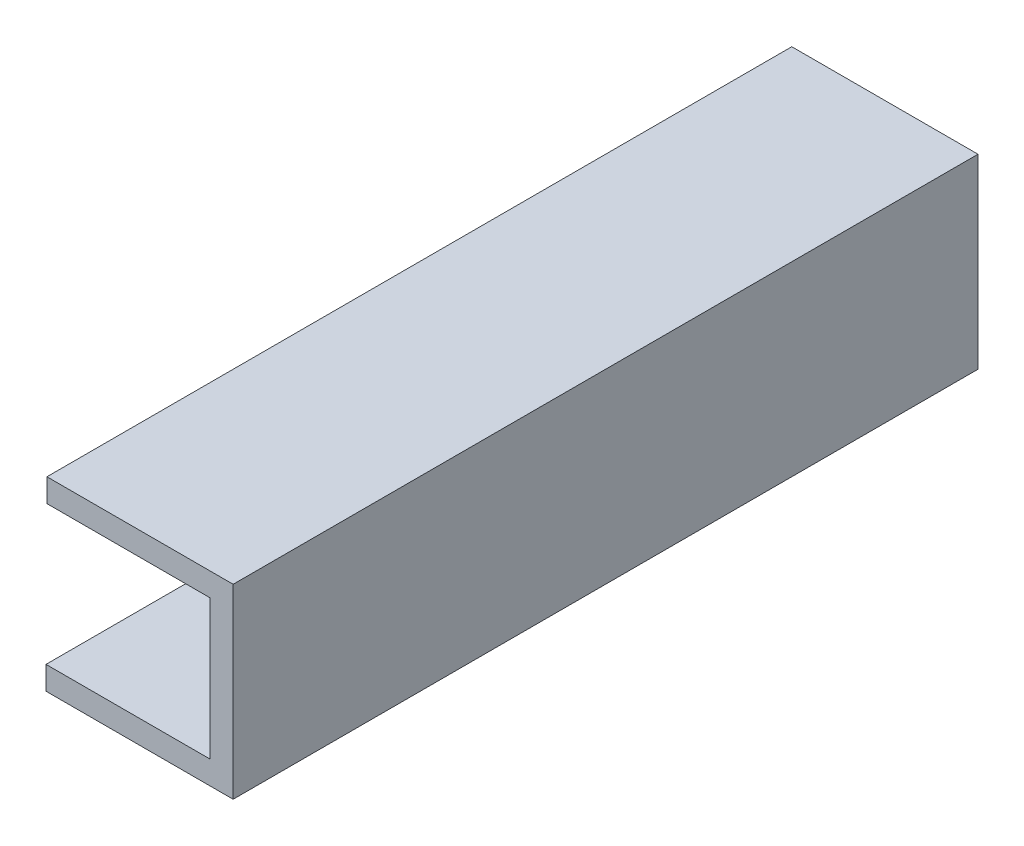
ISO-10303-21;
HEADER;
FILE_DESCRIPTION(('STEP AP214'),'2;1');
FILE_NAME('part.step','',(''),(''),'','','');
FILE_SCHEMA(('AUTOMOTIVE_DESIGN { 1 0 10303 214 1 1 1 1 }'));
ENDSEC;
DATA;
#1=APPLICATION_CONTEXT('core data for automotive mechanical design processes');
#2=APPLICATION_PROTOCOL_DEFINITION('international standard','automotive_design',2000,#1);
#3=PRODUCT_CONTEXT('',#1,'mechanical');
#4=PRODUCT('Part','Part','',(#3));
#5=PRODUCT_RELATED_PRODUCT_CATEGORY('part','',(#4));
#6=PRODUCT_DEFINITION_FORMATION('','',#4);
#7=PRODUCT_DEFINITION_CONTEXT('part definition',#1,'design');
#8=PRODUCT_DEFINITION('design','',#6,#7);
#9=PRODUCT_DEFINITION_SHAPE('','',#8);
#10=(LENGTH_UNIT() NAMED_UNIT(*) SI_UNIT(.MILLI.,.METRE.));
#11=(NAMED_UNIT(*) PLANE_ANGLE_UNIT() SI_UNIT($,.RADIAN.));
#12=(NAMED_UNIT(*) SI_UNIT($,.STERADIAN.) SOLID_ANGLE_UNIT());
#13=UNCERTAINTY_MEASURE_WITH_UNIT(LENGTH_MEASURE(1.E-05),#10,'distance_accuracy_value','');
#14=(GEOMETRIC_REPRESENTATION_CONTEXT(3) GLOBAL_UNCERTAINTY_ASSIGNED_CONTEXT((#13)) GLOBAL_UNIT_ASSIGNED_CONTEXT((#10,
#11,#12)) REPRESENTATION_CONTEXT('',''));
#15=CARTESIAN_POINT('',(0.,0.,0.));
#16=DIRECTION('',(0.,0.,1.));
#17=DIRECTION('',(1.,0.,0.));
#18=AXIS2_PLACEMENT_3D('',#15,#16,#17);
#19=CARTESIAN_POINT('',(-10.531581633942,6.84043592370634,101.6));
#20=DIRECTION('',(0.,-1.,0.));
#21=DIRECTION('',(1.,0.,0.));
#22=AXIS2_PLACEMENT_3D('',#19,#20,#21);
#23=PLANE('',#22);
#24=DIRECTION('',(-1.,0.,0.));
#25=VECTOR('',#24,1.);
#26=CARTESIAN_POINT('',(-10.531581633942,6.84043592370634,0.));
#27=LINE('',#26,#25);
#28=CARTESIAN_POINT('',(-10.531581633942,6.84043592370634,0.));
#29=VERTEX_POINT('',#28);
#30=CARTESIAN_POINT('',(-35.931581633942,6.84043592370634,0.));
#31=VERTEX_POINT('',#30);
#32=EDGE_CURVE('E129',#29,#31,#27,.T.);
#33=ORIENTED_EDGE('',*,*,#32,.T.);
#34=DIRECTION('',(0.,0.,-1.));
#35=VECTOR('',#34,1.);
#36=CARTESIAN_POINT('',(-35.931581633942,6.84043592370634,101.6));
#37=LINE('',#36,#35);
#38=CARTESIAN_POINT('',(-35.931581633942,6.84043592370634,101.6));
#39=VERTEX_POINT('',#38);
#40=EDGE_CURVE('E11',#39,#31,#37,.T.);
#41=ORIENTED_EDGE('',*,*,#40,.F.);
#42=DIRECTION('',(-1.,0.,0.));
#43=VECTOR('',#42,1.);
#44=CARTESIAN_POINT('',(-10.531581633942,6.84043592370634,101.6));
#45=LINE('',#44,#43);
#46=CARTESIAN_POINT('',(-10.531581633942,6.84043592370634,101.6));
#47=VERTEX_POINT('',#46);
#48=EDGE_CURVE('E143',#47,#39,#45,.T.);
#49=ORIENTED_EDGE('',*,*,#48,.F.);
#50=DIRECTION('',(0.,0.,-1.));
#51=VECTOR('',#50,1.);
#52=CARTESIAN_POINT('',(-10.531581633942,6.84043592370634,101.6));
#53=LINE('',#52,#51);
#54=EDGE_CURVE('E125',#47,#29,#53,.T.);
#55=ORIENTED_EDGE('',*,*,#54,.T.);
#56=EDGE_LOOP('',(#33,#41,#49,#55));
#57=FACE_BOUND('',#56,.T.);
#58=ADVANCED_FACE('F33',(#57),#23,.F.);
#59=CARTESIAN_POINT('',(-35.931581633942,6.84043592370634,101.6));
#60=DIRECTION('',(1.,0.,0.));
#61=DIRECTION('',(0.,0.,-1.));
#62=AXIS2_PLACEMENT_3D('',#59,#60,#61);
#63=PLANE('',#62);
#64=DIRECTION('',(0.,-1.,0.));
#65=VECTOR('',#64,1.);
#66=CARTESIAN_POINT('',(-35.931581633942,6.84043592370634,0.));
#67=LINE('',#66,#65);
#68=CARTESIAN_POINT('',(-35.931581633942,3.66543592370634,0.));
#69=VERTEX_POINT('',#68);
#70=EDGE_CURVE('E132',#31,#69,#67,.T.);
#71=ORIENTED_EDGE('',*,*,#70,.T.);
#72=DIRECTION('',(0.,0.,-1.));
#73=VECTOR('',#72,1.);
#74=CARTESIAN_POINT('',(-35.931581633942,3.66543592370634,101.6));
#75=LINE('',#74,#73);
#76=CARTESIAN_POINT('',(-35.931581633942,3.66543592370634,101.6));
#77=VERTEX_POINT('',#76);
#78=EDGE_CURVE('E41',#77,#69,#75,.T.);
#79=ORIENTED_EDGE('',*,*,#78,.F.);
#80=DIRECTION('',(0.,-1.,0.));
#81=VECTOR('',#80,1.);
#82=CARTESIAN_POINT('',(-35.931581633942,6.84043592370634,101.6));
#83=LINE('',#82,#81);
#84=EDGE_CURVE('E92',#39,#77,#83,.T.);
#85=ORIENTED_EDGE('',*,*,#84,.F.);
#86=ORIENTED_EDGE('',*,*,#40,.T.);
#87=EDGE_LOOP('',(#71,#79,#85,#86));
#88=FACE_BOUND('',#87,.T.);
#89=ADVANCED_FACE('F178',(#88),#63,.F.);
#90=CARTESIAN_POINT('',(-35.931581633942,3.66543592370634,101.6));
#91=DIRECTION('',(0.,1.,0.));
#92=DIRECTION('',(0.,0.,1.));
#93=AXIS2_PLACEMENT_3D('',#90,#91,#92);
#94=PLANE('',#93);
#95=DIRECTION('',(1.,0.,0.));
#96=VECTOR('',#95,1.);
#97=CARTESIAN_POINT('',(-35.931581633942,3.66543592370634,0.));
#98=LINE('',#97,#96);
#99=CARTESIAN_POINT('',(-13.706581633942,3.66543592370634,0.));
#100=VERTEX_POINT('',#99);
#101=EDGE_CURVE('E134',#69,#100,#98,.T.);
#102=ORIENTED_EDGE('',*,*,#101,.T.);
#103=DIRECTION('',(0.,0.,-1.));
#104=VECTOR('',#103,1.);
#105=CARTESIAN_POINT('',(-13.706581633942,3.66543592370634,101.6));
#106=LINE('',#105,#104);
#107=CARTESIAN_POINT('',(-13.706581633942,3.66543592370634,101.6));
#108=VERTEX_POINT('',#107);
#109=EDGE_CURVE('E150',#108,#100,#106,.T.);
#110=ORIENTED_EDGE('',*,*,#109,.F.);
#111=DIRECTION('',(1.,0.,0.));
#112=VECTOR('',#111,1.);
#113=CARTESIAN_POINT('',(-35.931581633942,3.66543592370634,101.6));
#114=LINE('',#113,#112);
#115=EDGE_CURVE('E158',#77,#108,#114,.T.);
#116=ORIENTED_EDGE('',*,*,#115,.F.);
#117=ORIENTED_EDGE('',*,*,#78,.T.);
#118=EDGE_LOOP('',(#102,#110,#116,#117));
#119=FACE_BOUND('',#118,.T.);
#120=ADVANCED_FACE('F156',(#119),#94,.F.);
#121=CARTESIAN_POINT('',(-13.706581633942,3.66543592370634,101.6));
#122=DIRECTION('',(1.,0.,0.));
#123=DIRECTION('',(0.,1.,0.));
#124=AXIS2_PLACEMENT_3D('',#121,#122,#123);
#125=PLANE('',#124);
#126=DIRECTION('',(0.,-1.,0.));
#127=VECTOR('',#126,1.);
#128=CARTESIAN_POINT('',(-13.706581633942,3.66543592370634,0.));
#129=LINE('',#128,#127);
#130=CARTESIAN_POINT('',(-13.706581633942,-15.3845640762937,0.));
#131=VERTEX_POINT('',#130);
#132=EDGE_CURVE('E136',#100,#131,#129,.T.);
#133=ORIENTED_EDGE('',*,*,#132,.T.);
#134=DIRECTION('',(0.,0.,-1.));
#135=VECTOR('',#134,1.);
#136=CARTESIAN_POINT('',(-13.706581633942,-15.3845640762937,101.6));
#137=LINE('',#136,#135);
#138=CARTESIAN_POINT('',(-13.706581633942,-15.3845640762937,101.6));
#139=VERTEX_POINT('',#138);
#140=EDGE_CURVE('E147',#139,#131,#137,.T.);
#141=ORIENTED_EDGE('',*,*,#140,.F.);
#142=DIRECTION('',(0.,-1.,0.));
#143=VECTOR('',#142,1.);
#144=CARTESIAN_POINT('',(-13.706581633942,3.66543592370634,101.6));
#145=LINE('',#144,#143);
#146=EDGE_CURVE('E170',#108,#139,#145,.T.);
#147=ORIENTED_EDGE('',*,*,#146,.F.);
#148=ORIENTED_EDGE('',*,*,#109,.T.);
#149=EDGE_LOOP('',(#133,#141,#147,#148));
#150=FACE_BOUND('',#149,.T.);
#151=ADVANCED_FACE('F166',(#150),#125,.F.);
#152=CARTESIAN_POINT('',(-13.706581633942,-15.3845640762937,101.6));
#153=DIRECTION('',(0.,-1.,0.));
#154=DIRECTION('',(1.,0.,0.));
#155=AXIS2_PLACEMENT_3D('',#152,#153,#154);
#156=PLANE('',#155);
#157=DIRECTION('',(-1.,0.,0.));
#158=VECTOR('',#157,1.);
#159=CARTESIAN_POINT('',(-13.706581633942,-15.3845640762937,0.));
#160=LINE('',#159,#158);
#161=CARTESIAN_POINT('',(-36.058581633942,-15.3845640762937,0.));
#162=VERTEX_POINT('',#161);
#163=EDGE_CURVE('E138',#131,#162,#160,.T.);
#164=ORIENTED_EDGE('',*,*,#163,.T.);
#165=DIRECTION('',(0.,0.,-1.));
#166=VECTOR('',#165,1.);
#167=CARTESIAN_POINT('',(-36.058581633942,-15.3845640762937,101.6));
#168=LINE('',#167,#166);
#169=CARTESIAN_POINT('',(-36.058581633942,-15.3845640762937,101.6));
#170=VERTEX_POINT('',#169);
#171=EDGE_CURVE('E120',#170,#162,#168,.T.);
#172=ORIENTED_EDGE('',*,*,#171,.F.);
#173=DIRECTION('',(-1.,0.,0.));
#174=VECTOR('',#173,1.);
#175=CARTESIAN_POINT('',(-13.706581633942,-15.3845640762937,101.6));
#176=LINE('',#175,#174);
#177=EDGE_CURVE('E111',#139,#170,#176,.T.);
#178=ORIENTED_EDGE('',*,*,#177,.F.);
#179=ORIENTED_EDGE('',*,*,#140,.T.);
#180=EDGE_LOOP('',(#164,#172,#178,#179));
#181=FACE_BOUND('',#180,.T.);
#182=ADVANCED_FACE('F169',(#181),#156,.F.);
#183=CARTESIAN_POINT('',(-36.058581633942,-15.3845640762937,101.6));
#184=DIRECTION('',(1.,0.,0.));
#185=DIRECTION('',(0.,0.,-1.));
#186=AXIS2_PLACEMENT_3D('',#183,#184,#185);
#187=PLANE('',#186);
#188=DIRECTION('',(0.,-1.,0.));
#189=VECTOR('',#188,1.);
#190=CARTESIAN_POINT('',(-36.058581633942,-15.3845640762937,0.));
#191=LINE('',#190,#189);
#192=CARTESIAN_POINT('',(-36.058581633942,-18.5595640762937,0.));
#193=VERTEX_POINT('',#192);
#194=EDGE_CURVE('E119',#162,#193,#191,.T.);
#195=ORIENTED_EDGE('',*,*,#194,.T.);
#196=DIRECTION('',(0.,0.,-1.));
#197=VECTOR('',#196,1.);
#198=CARTESIAN_POINT('',(-36.058581633942,-18.5595640762937,101.6));
#199=LINE('',#198,#197);
#200=CARTESIAN_POINT('',(-36.058581633942,-18.5595640762937,101.6));
#201=VERTEX_POINT('',#200);
#202=EDGE_CURVE('E116',#201,#193,#199,.T.);
#203=ORIENTED_EDGE('',*,*,#202,.F.);
#204=DIRECTION('',(0.,-1.,0.));
#205=VECTOR('',#204,1.);
#206=CARTESIAN_POINT('',(-36.058581633942,-15.3845640762937,101.6));
#207=LINE('',#206,#205);
#208=EDGE_CURVE('E105',#170,#201,#207,.T.);
#209=ORIENTED_EDGE('',*,*,#208,.F.);
#210=ORIENTED_EDGE('',*,*,#171,.T.);
#211=EDGE_LOOP('',(#195,#203,#209,#210));
#212=FACE_BOUND('',#211,.T.);
#213=ADVANCED_FACE('F117',(#212),#187,.F.);
#214=CARTESIAN_POINT('',(-36.058581633942,-18.5595640762937,101.6));
#215=DIRECTION('',(0.,1.,0.));
#216=DIRECTION('',(0.,0.,1.));
#217=AXIS2_PLACEMENT_3D('',#214,#215,#216);
#218=PLANE('',#217);
#219=DIRECTION('',(1.,0.,0.));
#220=VECTOR('',#219,1.);
#221=CARTESIAN_POINT('',(-36.058581633942,-18.5595640762937,0.));
#222=LINE('',#221,#220);
#223=CARTESIAN_POINT('',(-10.531581633942,-18.5595640762937,0.));
#224=VERTEX_POINT('',#223);
#225=EDGE_CURVE('E78',#193,#224,#222,.T.);
#226=ORIENTED_EDGE('',*,*,#225,.T.);
#227=DIRECTION('',(0.,0.,-1.));
#228=VECTOR('',#227,1.);
#229=CARTESIAN_POINT('',(-10.531581633942,-18.5595640762937,101.6));
#230=LINE('',#229,#228);
#231=CARTESIAN_POINT('',(-10.531581633942,-18.5595640762937,101.6));
#232=VERTEX_POINT('',#231);
#233=EDGE_CURVE('E121',#232,#224,#230,.T.);
#234=ORIENTED_EDGE('',*,*,#233,.F.);
#235=DIRECTION('',(1.,0.,0.));
#236=VECTOR('',#235,1.);
#237=CARTESIAN_POINT('',(-36.058581633942,-18.5595640762937,101.6));
#238=LINE('',#237,#236);
#239=EDGE_CURVE('E109',#201,#232,#238,.T.);
#240=ORIENTED_EDGE('',*,*,#239,.F.);
#241=ORIENTED_EDGE('',*,*,#202,.T.);
#242=EDGE_LOOP('',(#226,#234,#240,#241));
#243=FACE_BOUND('',#242,.T.);
#244=ADVANCED_FACE('F123',(#243),#218,.F.);
#245=CARTESIAN_POINT('',(-10.531581633942,-18.5595640762937,101.6));
#246=DIRECTION('',(-1.,0.,0.));
#247=DIRECTION('',(0.,0.,1.));
#248=AXIS2_PLACEMENT_3D('',#245,#246,#247);
#249=PLANE('',#248);
#250=DIRECTION('',(0.,1.,0.));
#251=VECTOR('',#250,1.);
#252=CARTESIAN_POINT('',(-10.531581633942,-18.5595640762937,0.));
#253=LINE('',#252,#251);
#254=EDGE_CURVE('E84',#224,#29,#253,.T.);
#255=ORIENTED_EDGE('',*,*,#254,.T.);
#256=ORIENTED_EDGE('',*,*,#54,.F.);
#257=DIRECTION('',(0.,1.,0.));
#258=VECTOR('',#257,1.);
#259=CARTESIAN_POINT('',(-10.531581633942,-18.5595640762937,101.6));
#260=LINE('',#259,#258);
#261=EDGE_CURVE('E49',#232,#47,#260,.T.);
#262=ORIENTED_EDGE('',*,*,#261,.F.);
#263=ORIENTED_EDGE('',*,*,#233,.T.);
#264=EDGE_LOOP('',(#255,#256,#262,#263));
#265=FACE_BOUND('',#264,.T.);
#266=ADVANCED_FACE('F194',(#265),#249,.F.);
#267=CARTESIAN_POINT('',(0.,0.,101.6));
#268=DIRECTION('',(0.,0.,1.));
#269=DIRECTION('',(1.,0.,0.));
#270=AXIS2_PLACEMENT_3D('',#267,#268,#269);
#271=PLANE('',#270);
#272=ORIENTED_EDGE('',*,*,#48,.T.);
#273=ORIENTED_EDGE('',*,*,#84,.T.);
#274=ORIENTED_EDGE('',*,*,#115,.T.);
#275=ORIENTED_EDGE('',*,*,#146,.T.);
#276=ORIENTED_EDGE('',*,*,#177,.T.);
#277=ORIENTED_EDGE('',*,*,#208,.T.);
#278=ORIENTED_EDGE('',*,*,#239,.T.);
#279=ORIENTED_EDGE('',*,*,#261,.T.);
#280=EDGE_LOOP('',(#272,#273,#274,#275,#276,#277,#278,#279));
#281=FACE_BOUND('',#280,.T.);
#282=ADVANCED_FACE('F107',(#281),#271,.T.);
#283=CARTESIAN_POINT('',(0.,0.,0.));
#284=DIRECTION('',(0.,0.,1.));
#285=DIRECTION('',(1.,0.,0.));
#286=AXIS2_PLACEMENT_3D('',#283,#284,#285);
#287=PLANE('',#286);
#288=ORIENTED_EDGE('',*,*,#32,.F.);
#289=ORIENTED_EDGE('',*,*,#254,.F.);
#290=ORIENTED_EDGE('',*,*,#225,.F.);
#291=ORIENTED_EDGE('',*,*,#194,.F.);
#292=ORIENTED_EDGE('',*,*,#163,.F.);
#293=ORIENTED_EDGE('',*,*,#132,.F.);
#294=ORIENTED_EDGE('',*,*,#101,.F.);
#295=ORIENTED_EDGE('',*,*,#70,.F.);
#296=EDGE_LOOP('',(#288,#289,#290,#291,#292,#293,#294,#295));
#297=FACE_BOUND('',#296,.T.);
#298=ADVANCED_FACE('F162',(#297),#287,.F.);
#299=CLOSED_SHELL('',(#58,#89,#120,#151,#182,#213,#244,#266,#282,#298));
#300=MANIFOLD_SOLID_BREP('B2',#299);
#301=ADVANCED_BREP_SHAPE_REPRESENTATION('',(#18,#300),#14);
#302=SHAPE_DEFINITION_REPRESENTATION(#9,#301);
ENDSEC;
END-ISO-10303-21;
